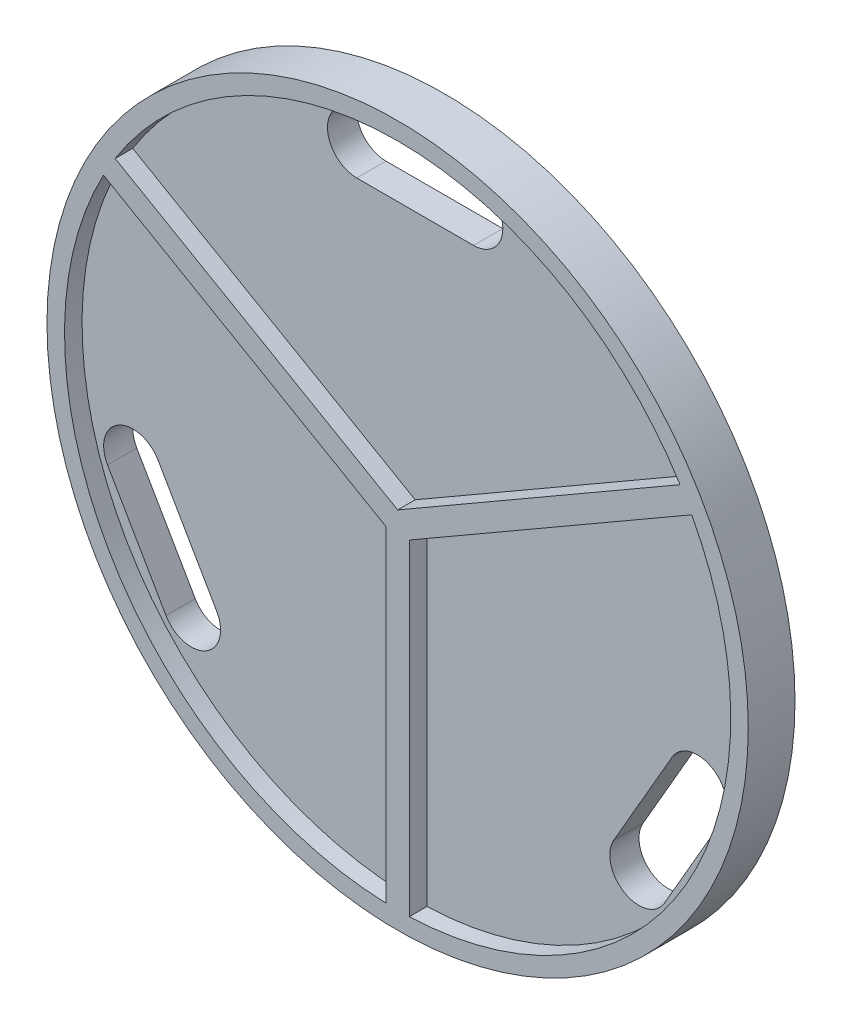
ISO-10303-21;
HEADER;
FILE_DESCRIPTION(('STEP AP214'),'2;1');
FILE_NAME('part.step','',(''),(''),'','','');
FILE_SCHEMA(('AUTOMOTIVE_DESIGN { 1 0 10303 214 1 1 1 1 }'));
ENDSEC;
DATA;
#1=APPLICATION_CONTEXT('core data for automotive mechanical design processes');
#2=APPLICATION_PROTOCOL_DEFINITION('international standard','automotive_design',2000,#1);
#3=PRODUCT_CONTEXT('',#1,'mechanical');
#4=PRODUCT('Part','Part','',(#3));
#5=PRODUCT_RELATED_PRODUCT_CATEGORY('part','',(#4));
#6=PRODUCT_DEFINITION_FORMATION('','',#4);
#7=PRODUCT_DEFINITION_CONTEXT('part definition',#1,'design');
#8=PRODUCT_DEFINITION('design','',#6,#7);
#9=PRODUCT_DEFINITION_SHAPE('','',#8);
#10=(LENGTH_UNIT() NAMED_UNIT(*) SI_UNIT(.MILLI.,.METRE.));
#11=(NAMED_UNIT(*) PLANE_ANGLE_UNIT() SI_UNIT($,.RADIAN.));
#12=(NAMED_UNIT(*) SI_UNIT($,.STERADIAN.) SOLID_ANGLE_UNIT());
#13=UNCERTAINTY_MEASURE_WITH_UNIT(LENGTH_MEASURE(1.E-05),#10,'distance_accuracy_value','');
#14=(GEOMETRIC_REPRESENTATION_CONTEXT(3) GLOBAL_UNCERTAINTY_ASSIGNED_CONTEXT((#13)) GLOBAL_UNIT_ASSIGNED_CONTEXT((#10,
#11,#12)) REPRESENTATION_CONTEXT('',''));
#15=CARTESIAN_POINT('',(0.,0.,0.));
#16=DIRECTION('',(0.,0.,1.));
#17=DIRECTION('',(1.,0.,0.));
#18=AXIS2_PLACEMENT_3D('',#15,#16,#17);
#19=CARTESIAN_POINT('',(0.,0.,5.));
#20=DIRECTION('',(0.,0.,1.));
#21=DIRECTION('',(1.,0.,0.));
#22=AXIS2_PLACEMENT_3D('',#19,#20,#21);
#23=PLANE('',#22);
#24=DIRECTION('',(-0.866025403784436,0.500000000000004,0.));
#25=VECTOR('',#24,1.);
#26=CARTESIAN_POINT('',(-1.00000000000001,-1.73205080756887,5.));
#27=LINE('',#26,#25);
#28=CARTESIAN_POINT('',(-1.99999999999999,-1.15470053837925,5.));
#29=VERTEX_POINT('',#28);
#30=CARTESIAN_POINT('',(-50.3330518009984,26.7503999296836,5.));
#31=VERTEX_POINT('',#30);
#32=EDGE_CURVE('E205',#29,#31,#27,.T.);
#33=ORIENTED_EDGE('',*,*,#32,.T.);
#34=CARTESIAN_POINT('',(0.,0.,5.));
#35=DIRECTION('',(0.,0.,1.));
#36=DIRECTION('',(1.,0.,0.));
#37=AXIS2_PLACEMENT_3D('',#34,#35,#36);
#38=CIRCLE('',#37,57.);
#39=CARTESIAN_POINT('',(-1.99999999999925,-56.9649014745045,5.));
#40=VERTEX_POINT('',#39);
#41=EDGE_CURVE('E252',#31,#40,#38,.T.);
#42=ORIENTED_EDGE('',*,*,#41,.T.);
#43=DIRECTION('',(0.,-1.,0.));
#44=VECTOR('',#43,1.);
#45=CARTESIAN_POINT('',(-2.,0.,5.));
#46=LINE('',#45,#44);
#47=EDGE_CURVE('E57',#29,#40,#46,.T.);
#48=ORIENTED_EDGE('',*,*,#47,.F.);
#49=EDGE_LOOP('',(#33,#42,#48));
#50=FACE_BOUND('',#49,.T.);
#51=DIRECTION('',(0.499999999999998,-0.86602540378444,0.));
#52=VECTOR('',#51,1.);
#53=CARTESIAN_POINT('',(-52.6313972081443,-18.8397459621553,5.));
#54=LINE('',#53,#52);
#55=CARTESIAN_POINT('',(-52.6313972081443,-18.8397459621553,5.));
#56=VERTEX_POINT('',#55);
#57=CARTESIAN_POINT('',(-42.6313972081441,-36.1602540378445,5.));
#58=VERTEX_POINT('',#57);
#59=EDGE_CURVE('E348',#56,#58,#54,.T.);
#60=ORIENTED_EDGE('',*,*,#59,.F.);
#61=CARTESIAN_POINT('',(-48.3012701892221,-16.3397459621553,5.));
#62=DIRECTION('',(0.,0.,1.));
#63=DIRECTION('',(1.,0.,0.));
#64=AXIS2_PLACEMENT_3D('',#61,#62,#63);
#65=CIRCLE('',#64,5.);
#66=CARTESIAN_POINT('',(-43.9711431702998,-13.8397459621554,5.));
#67=VERTEX_POINT('',#66);
#68=EDGE_CURVE('E345',#67,#56,#65,.T.);
#69=ORIENTED_EDGE('',*,*,#68,.F.);
#70=DIRECTION('',(-0.499999999999998,0.86602540378444,0.));
#71=VECTOR('',#70,1.);
#72=CARTESIAN_POINT('',(-43.9711431702998,-13.8397459621554,5.));
#73=LINE('',#72,#71);
#74=CARTESIAN_POINT('',(-33.9711431702997,-31.1602540378445,5.));
#75=VERTEX_POINT('',#74);
#76=EDGE_CURVE('E356',#75,#67,#73,.T.);
#77=ORIENTED_EDGE('',*,*,#76,.F.);
#78=CARTESIAN_POINT('',(-38.301270189222,-33.6602540378443,5.));
#79=DIRECTION('',(0.,0.,1.));
#80=DIRECTION('',(1.,0.,0.));
#81=AXIS2_PLACEMENT_3D('',#78,#79,#80);
#82=CIRCLE('',#81,5.);
#83=EDGE_CURVE('E352',#58,#75,#82,.T.);
#84=ORIENTED_EDGE('',*,*,#83,.F.);
#85=EDGE_LOOP('',(#60,#69,#77,#84));
#86=FACE_BOUND('',#85,.T.);
#87=ADVANCED_FACE('F41',(#50,#86),#23,.T.);
#88=DIRECTION('',(0.,-1.,0.));
#89=VECTOR('',#88,1.);
#90=CARTESIAN_POINT('',(2.,0.,5.));
#91=LINE('',#90,#89);
#92=CARTESIAN_POINT('',(2.00000000000002,-1.15470053837924,5.));
#93=VERTEX_POINT('',#92);
#94=CARTESIAN_POINT('',(2.00000000000074,-56.9649014745044,5.));
#95=VERTEX_POINT('',#94);
#96=EDGE_CURVE('E198',#93,#95,#91,.T.);
#97=ORIENTED_EDGE('',*,*,#96,.T.);
#98=CARTESIAN_POINT('',(50.3330518009984,26.7503999296836,5.));
#99=VERTEX_POINT('',#98);
#100=EDGE_CURVE('E249',#95,#99,#38,.T.);
#101=ORIENTED_EDGE('',*,*,#100,.T.);
#102=DIRECTION('',(0.866025403784436,0.500000000000004,0.));
#103=VECTOR('',#102,1.);
#104=CARTESIAN_POINT('',(1.00000000000001,-1.73205080756887,5.));
#105=LINE('',#104,#103);
#106=EDGE_CURVE('E65',#93,#99,#105,.T.);
#107=ORIENTED_EDGE('',*,*,#106,.F.);
#108=EDGE_LOOP('',(#97,#101,#107));
#109=FACE_BOUND('',#108,.T.);
#110=DIRECTION('',(-0.499999999999997,-0.86602540378444,0.));
#111=VECTOR('',#110,1.);
#112=CARTESIAN_POINT('',(43.9711431702998,-13.8397459621554,5.));
#113=LINE('',#112,#111);
#114=CARTESIAN_POINT('',(43.9711431702998,-13.8397459621554,5.));
#115=VERTEX_POINT('',#114);
#116=CARTESIAN_POINT('',(33.9711431702997,-31.1602540378445,5.));
#117=VERTEX_POINT('',#116);
#118=EDGE_CURVE('E305',#115,#117,#113,.T.);
#119=ORIENTED_EDGE('',*,*,#118,.F.);
#120=CARTESIAN_POINT('',(48.3012701892221,-16.3397459621553,5.));
#121=DIRECTION('',(0.,0.,1.));
#122=DIRECTION('',(-1.,0.,0.));
#123=AXIS2_PLACEMENT_3D('',#120,#121,#122);
#124=CIRCLE('',#123,5.00000000000002);
#125=CARTESIAN_POINT('',(52.6313972081443,-18.8397459621553,5.));
#126=VERTEX_POINT('',#125);
#127=EDGE_CURVE('E302',#126,#115,#124,.T.);
#128=ORIENTED_EDGE('',*,*,#127,.F.);
#129=DIRECTION('',(0.499999999999998,0.86602540378444,0.));
#130=VECTOR('',#129,1.);
#131=CARTESIAN_POINT('',(52.6313972081443,-18.8397459621553,5.));
#132=LINE('',#131,#130);
#133=CARTESIAN_POINT('',(42.6313972081441,-36.1602540378445,5.));
#134=VERTEX_POINT('',#133);
#135=EDGE_CURVE('E313',#134,#126,#132,.T.);
#136=ORIENTED_EDGE('',*,*,#135,.F.);
#137=CARTESIAN_POINT('',(38.301270189222,-33.6602540378443,5.));
#138=DIRECTION('',(0.,0.,1.));
#139=DIRECTION('',(-1.,0.,0.));
#140=AXIS2_PLACEMENT_3D('',#137,#138,#139);
#141=CIRCLE('',#140,5.);
#142=EDGE_CURVE('E309',#117,#134,#141,.T.);
#143=ORIENTED_EDGE('',*,*,#142,.F.);
#144=EDGE_LOOP('',(#119,#128,#136,#143));
#145=FACE_BOUND('',#144,.T.);
#146=ADVANCED_FACE('F415',(#109,#145),#23,.T.);
#147=CARTESIAN_POINT('',(0.,0.,8.));
#148=DIRECTION('',(0.,0.,-1.));
#149=DIRECTION('',(-1.,0.,0.));
#150=AXIS2_PLACEMENT_3D('',#147,#148,#149);
#151=CYLINDRICAL_SURFACE('',#150,57.);
#152=DIRECTION('',(0.,0.,-1.));
#153=VECTOR('',#152,1.);
#154=CARTESIAN_POINT('',(-50.3330518009984,26.7503999296836,141.191717813532));
#155=LINE('',#154,#153);
#156=CARTESIAN_POINT('',(-50.3330518009984,26.7503999296836,8.));
#157=VERTEX_POINT('',#156);
#158=EDGE_CURVE('E207',#157,#31,#155,.T.);
#159=ORIENTED_EDGE('',*,*,#158,.F.);
#160=CARTESIAN_POINT('',(0.,0.,8.));
#161=DIRECTION('',(0.,0.,1.));
#162=DIRECTION('',(1.,0.,0.));
#163=AXIS2_PLACEMENT_3D('',#160,#161,#162);
#164=CIRCLE('',#163,57.);
#165=CARTESIAN_POINT('',(-1.99999999999925,-56.9649014745045,8.));
#166=VERTEX_POINT('',#165);
#167=EDGE_CURVE('E211',#157,#166,#164,.T.);
#168=ORIENTED_EDGE('',*,*,#167,.T.);
#169=DIRECTION('',(0.,0.,-1.));
#170=VECTOR('',#169,1.);
#171=CARTESIAN_POINT('',(-1.99999999999925,-56.9649014745045,141.191717813532));
#172=LINE('',#171,#170);
#173=EDGE_CURVE('E192',#166,#40,#172,.T.);
#174=ORIENTED_EDGE('',*,*,#173,.T.);
#175=ORIENTED_EDGE('',*,*,#41,.F.);
#176=EDGE_LOOP('',(#159,#168,#174,#175));
#177=FACE_BOUND('',#176,.T.);
#178=ADVANCED_FACE('F421',(#177),#151,.F.);
#179=DIRECTION('',(0.,0.,-1.));
#180=VECTOR('',#179,1.);
#181=CARTESIAN_POINT('',(2.00000000000074,-56.9649014745044,141.191717813532));
#182=LINE('',#181,#180);
#183=CARTESIAN_POINT('',(2.00000000000074,-56.9649014745044,8.00000000000001));
#184=VERTEX_POINT('',#183);
#185=EDGE_CURVE('E221',#184,#95,#182,.T.);
#186=ORIENTED_EDGE('',*,*,#185,.F.);
#187=CARTESIAN_POINT('',(50.3330518009984,26.7503999296836,8.));
#188=VERTEX_POINT('',#187);
#189=EDGE_CURVE('E244',#184,#188,#164,.T.);
#190=ORIENTED_EDGE('',*,*,#189,.T.);
#191=DIRECTION('',(0.,0.,-1.));
#192=VECTOR('',#191,1.);
#193=CARTESIAN_POINT('',(50.3330518009984,26.7503999296836,141.191717813532));
#194=LINE('',#193,#192);
#195=EDGE_CURVE('E228',#188,#99,#194,.T.);
#196=ORIENTED_EDGE('',*,*,#195,.T.);
#197=ORIENTED_EDGE('',*,*,#100,.F.);
#198=EDGE_LOOP('',(#186,#190,#196,#197));
#199=FACE_BOUND('',#198,.T.);
#200=ADVANCED_FACE('F424',(#199),#151,.F.);
#201=DIRECTION('',(0.866025403784436,0.500000000000004,0.));
#202=VECTOR('',#201,1.);
#203=CARTESIAN_POINT('',(-1.00000000000001,1.73205080756887,5.));
#204=LINE('',#203,#202);
#205=CARTESIAN_POINT('',(0.,2.30940107675851,5.));
#206=VERTEX_POINT('',#205);
#207=CARTESIAN_POINT('',(48.3330518009984,30.2145015448213,5.));
#208=VERTEX_POINT('',#207);
#209=EDGE_CURVE('E437',#206,#208,#204,.T.);
#210=ORIENTED_EDGE('',*,*,#209,.T.);
#211=CARTESIAN_POINT('',(-48.3330518009983,30.2145015448213,5.));
#212=VERTEX_POINT('',#211);
#213=EDGE_CURVE('E247',#208,#212,#38,.T.);
#214=ORIENTED_EDGE('',*,*,#213,.T.);
#215=DIRECTION('',(-0.866025403784436,0.500000000000004,0.));
#216=VECTOR('',#215,1.);
#217=CARTESIAN_POINT('',(1.00000000000001,1.73205080756887,5.));
#218=LINE('',#217,#216);
#219=EDGE_CURVE('E240',#206,#212,#218,.T.);
#220=ORIENTED_EDGE('',*,*,#219,.F.);
#221=EDGE_LOOP('',(#210,#214,#220));
#222=FACE_BOUND('',#221,.T.);
#223=DIRECTION('',(-1.,0.,0.));
#224=VECTOR('',#223,1.);
#225=CARTESIAN_POINT('',(10.0000000000006,55.,5.));
#226=LINE('',#225,#224);
#227=CARTESIAN_POINT('',(10.0000000000006,55.,5.));
#228=VERTEX_POINT('',#227);
#229=CARTESIAN_POINT('',(-9.99999999999983,55.0000000000001,5.));
#230=VERTEX_POINT('',#229);
#231=EDGE_CURVE('E262',#228,#230,#226,.T.);
#232=ORIENTED_EDGE('',*,*,#231,.F.);
#233=CARTESIAN_POINT('',(10.0000000000005,50.,5.));
#234=DIRECTION('',(0.,0.,1.));
#235=DIRECTION('',(1.,0.,0.));
#236=AXIS2_PLACEMENT_3D('',#233,#234,#235);
#237=CIRCLE('',#236,5.00000000000001);
#238=CARTESIAN_POINT('',(10.0000000000004,44.9999999999999,5.));
#239=VERTEX_POINT('',#238);
#240=EDGE_CURVE('E259',#239,#228,#237,.T.);
#241=ORIENTED_EDGE('',*,*,#240,.F.);
#242=DIRECTION('',(1.,0.,0.));
#243=VECTOR('',#242,1.);
#244=CARTESIAN_POINT('',(10.0000000000004,44.9999999999999,5.));
#245=LINE('',#244,#243);
#246=CARTESIAN_POINT('',(-9.99999999999993,45.0000000000001,5.));
#247=VERTEX_POINT('',#246);
#248=EDGE_CURVE('E270',#247,#239,#245,.T.);
#249=ORIENTED_EDGE('',*,*,#248,.F.);
#250=CARTESIAN_POINT('',(-9.99999999999969,50.0000000000001,5.));
#251=DIRECTION('',(0.,0.,1.));
#252=DIRECTION('',(1.,0.,0.));
#253=AXIS2_PLACEMENT_3D('',#250,#251,#252);
#254=CIRCLE('',#253,5.00000000000002);
#255=EDGE_CURVE('E266',#230,#247,#254,.T.);
#256=ORIENTED_EDGE('',*,*,#255,.F.);
#257=EDGE_LOOP('',(#232,#241,#249,#256));
#258=FACE_BOUND('',#257,.T.);
#259=ADVANCED_FACE('F417',(#222,#258),#23,.T.);
#260=CARTESIAN_POINT('',(0.,0.,0.));
#261=DIRECTION('',(0.,0.,1.));
#262=DIRECTION('',(1.,0.,0.));
#263=AXIS2_PLACEMENT_3D('',#260,#261,#262);
#264=PLANE('',#263);
#265=CARTESIAN_POINT('',(48.3012701892221,-16.3397459621553,0.));
#266=DIRECTION('',(0.,0.,1.));
#267=DIRECTION('',(-1.,0.,0.));
#268=AXIS2_PLACEMENT_3D('',#265,#266,#267);
#269=CIRCLE('',#268,5.00000000000002);
#270=CARTESIAN_POINT('',(52.6313972081443,-18.8397459621553,0.));
#271=VERTEX_POINT('',#270);
#272=CARTESIAN_POINT('',(43.9711431702998,-13.8397459621554,0.));
#273=VERTEX_POINT('',#272);
#274=EDGE_CURVE('E301',#271,#273,#269,.T.);
#275=ORIENTED_EDGE('',*,*,#274,.T.);
#276=DIRECTION('',(-0.499999999999997,-0.86602540378444,0.));
#277=VECTOR('',#276,1.);
#278=CARTESIAN_POINT('',(43.9711431702998,-13.8397459621554,0.));
#279=LINE('',#278,#277);
#280=CARTESIAN_POINT('',(33.9711431702997,-31.1602540378445,0.));
#281=VERTEX_POINT('',#280);
#282=EDGE_CURVE('E320',#273,#281,#279,.T.);
#283=ORIENTED_EDGE('',*,*,#282,.T.);
#284=CARTESIAN_POINT('',(38.301270189222,-33.6602540378443,0.));
#285=DIRECTION('',(0.,0.,1.));
#286=DIRECTION('',(-1.,0.,0.));
#287=AXIS2_PLACEMENT_3D('',#284,#285,#286);
#288=CIRCLE('',#287,5.);
#289=CARTESIAN_POINT('',(42.6313972081441,-36.1602540378445,0.));
#290=VERTEX_POINT('',#289);
#291=EDGE_CURVE('E324',#281,#290,#288,.T.);
#292=ORIENTED_EDGE('',*,*,#291,.T.);
#293=DIRECTION('',(0.499999999999998,0.86602540378444,0.));
#294=VECTOR('',#293,1.);
#295=CARTESIAN_POINT('',(52.6313972081443,-18.8397459621553,0.));
#296=LINE('',#295,#294);
#297=EDGE_CURVE('E306',#290,#271,#296,.T.);
#298=ORIENTED_EDGE('',*,*,#297,.T.);
#299=EDGE_LOOP('',(#275,#283,#292,#298));
#300=FACE_BOUND('',#299,.T.);
#301=CARTESIAN_POINT('',(0.,0.,0.));
#302=DIRECTION('',(0.,0.,1.));
#303=DIRECTION('',(1.,0.,0.));
#304=AXIS2_PLACEMENT_3D('',#301,#302,#303);
#305=CIRCLE('',#304,60.);
#306=CARTESIAN_POINT('',(60.,0.,0.));
#307=VERTEX_POINT('',#306);
#308=EDGE_CURVE('E11',#307,#307,#305,.T.);
#309=ORIENTED_EDGE('',*,*,#308,.F.);
#310=EDGE_LOOP('',(#309));
#311=FACE_BOUND('',#310,.T.);
#312=CARTESIAN_POINT('',(-48.3012701892221,-16.3397459621553,0.));
#313=DIRECTION('',(0.,0.,1.));
#314=DIRECTION('',(1.,0.,0.));
#315=AXIS2_PLACEMENT_3D('',#312,#313,#314);
#316=CIRCLE('',#315,5.);
#317=CARTESIAN_POINT('',(-43.9711431702998,-13.8397459621554,0.));
#318=VERTEX_POINT('',#317);
#319=CARTESIAN_POINT('',(-52.6313972081443,-18.8397459621553,0.));
#320=VERTEX_POINT('',#319);
#321=EDGE_CURVE('E344',#318,#320,#316,.T.);
#322=ORIENTED_EDGE('',*,*,#321,.T.);
#323=DIRECTION('',(0.499999999999998,-0.86602540378444,0.));
#324=VECTOR('',#323,1.);
#325=CARTESIAN_POINT('',(-52.6313972081443,-18.8397459621553,0.));
#326=LINE('',#325,#324);
#327=CARTESIAN_POINT('',(-42.6313972081441,-36.1602540378445,0.));
#328=VERTEX_POINT('',#327);
#329=EDGE_CURVE('E363',#320,#328,#326,.T.);
#330=ORIENTED_EDGE('',*,*,#329,.T.);
#331=CARTESIAN_POINT('',(-38.301270189222,-33.6602540378443,0.));
#332=DIRECTION('',(0.,0.,1.));
#333=DIRECTION('',(1.,0.,0.));
#334=AXIS2_PLACEMENT_3D('',#331,#332,#333);
#335=CIRCLE('',#334,5.);
#336=CARTESIAN_POINT('',(-33.9711431702997,-31.1602540378445,0.));
#337=VERTEX_POINT('',#336);
#338=EDGE_CURVE('E367',#328,#337,#335,.T.);
#339=ORIENTED_EDGE('',*,*,#338,.T.);
#340=DIRECTION('',(-0.499999999999998,0.86602540378444,0.));
#341=VECTOR('',#340,1.);
#342=CARTESIAN_POINT('',(-43.9711431702998,-13.8397459621554,0.));
#343=LINE('',#342,#341);
#344=EDGE_CURVE('E349',#337,#318,#343,.T.);
#345=ORIENTED_EDGE('',*,*,#344,.T.);
#346=EDGE_LOOP('',(#322,#330,#339,#345));
#347=FACE_BOUND('',#346,.T.);
#348=CARTESIAN_POINT('',(10.0000000000005,50.,0.));
#349=DIRECTION('',(0.,0.,1.));
#350=DIRECTION('',(1.,0.,0.));
#351=AXIS2_PLACEMENT_3D('',#348,#349,#350);
#352=CIRCLE('',#351,5.00000000000001);
#353=CARTESIAN_POINT('',(10.0000000000004,44.9999999999999,0.));
#354=VERTEX_POINT('',#353);
#355=CARTESIAN_POINT('',(10.0000000000006,55.,0.));
#356=VERTEX_POINT('',#355);
#357=EDGE_CURVE('E258',#354,#356,#352,.T.);
#358=ORIENTED_EDGE('',*,*,#357,.T.);
#359=DIRECTION('',(-1.,0.,0.));
#360=VECTOR('',#359,1.);
#361=CARTESIAN_POINT('',(10.0000000000006,55.,0.));
#362=LINE('',#361,#360);
#363=CARTESIAN_POINT('',(-9.99999999999983,55.0000000000001,0.));
#364=VERTEX_POINT('',#363);
#365=EDGE_CURVE('E277',#356,#364,#362,.T.);
#366=ORIENTED_EDGE('',*,*,#365,.T.);
#367=CARTESIAN_POINT('',(-9.99999999999969,50.0000000000001,0.));
#368=DIRECTION('',(0.,0.,1.));
#369=DIRECTION('',(1.,0.,0.));
#370=AXIS2_PLACEMENT_3D('',#367,#368,#369);
#371=CIRCLE('',#370,5.00000000000002);
#372=CARTESIAN_POINT('',(-9.99999999999993,45.0000000000001,0.));
#373=VERTEX_POINT('',#372);
#374=EDGE_CURVE('E281',#364,#373,#371,.T.);
#375=ORIENTED_EDGE('',*,*,#374,.T.);
#376=DIRECTION('',(1.,0.,0.));
#377=VECTOR('',#376,1.);
#378=CARTESIAN_POINT('',(10.0000000000004,44.9999999999999,0.));
#379=LINE('',#378,#377);
#380=EDGE_CURVE('E263',#373,#354,#379,.T.);
#381=ORIENTED_EDGE('',*,*,#380,.T.);
#382=EDGE_LOOP('',(#358,#366,#375,#381));
#383=FACE_BOUND('',#382,.T.);
#384=ADVANCED_FACE('F392',(#300,#311,#347,#383),#264,.F.);
#385=CARTESIAN_POINT('',(0.,0.,5.));
#386=DIRECTION('',(0.,0.,-1.));
#387=DIRECTION('',(-1.,0.,0.));
#388=AXIS2_PLACEMENT_3D('',#385,#386,#387);
#389=CYLINDRICAL_SURFACE('',#388,60.);
#390=ORIENTED_EDGE('',*,*,#308,.T.);
#391=EDGE_LOOP('',(#390));
#392=FACE_BOUND('',#391,.T.);
#393=CARTESIAN_POINT('',(0.,0.,8.));
#394=DIRECTION('',(0.,0.,1.));
#395=DIRECTION('',(1.,0.,0.));
#396=AXIS2_PLACEMENT_3D('',#393,#394,#395);
#397=CIRCLE('',#396,60.);
#398=CARTESIAN_POINT('',(60.,0.,8.));
#399=VERTEX_POINT('',#398);
#400=EDGE_CURVE('E254',#399,#399,#397,.T.);
#401=ORIENTED_EDGE('',*,*,#400,.F.);
#402=EDGE_LOOP('',(#401));
#403=FACE_BOUND('',#402,.T.);
#404=ADVANCED_FACE('F43',(#392,#403),#389,.T.);
#405=CARTESIAN_POINT('',(-48.3012701892221,-16.3397459621553,5.));
#406=DIRECTION('',(0.,0.,-1.));
#407=DIRECTION('',(-1.,0.,0.));
#408=AXIS2_PLACEMENT_3D('',#405,#406,#407);
#409=CYLINDRICAL_SURFACE('',#408,5.);
#410=ORIENTED_EDGE('',*,*,#321,.F.);
#411=DIRECTION('',(0.,0.,-1.));
#412=VECTOR('',#411,1.);
#413=CARTESIAN_POINT('',(-43.9711431702998,-13.8397459621554,5.));
#414=LINE('',#413,#412);
#415=EDGE_CURVE('E359',#67,#318,#414,.T.);
#416=ORIENTED_EDGE('',*,*,#415,.F.);
#417=ORIENTED_EDGE('',*,*,#68,.T.);
#418=DIRECTION('',(0.,0.,-1.));
#419=VECTOR('',#418,1.);
#420=CARTESIAN_POINT('',(-52.6313972081443,-18.8397459621553,5.));
#421=LINE('',#420,#419);
#422=EDGE_CURVE('E50',#56,#320,#421,.T.);
#423=ORIENTED_EDGE('',*,*,#422,.T.);
#424=EDGE_LOOP('',(#410,#416,#417,#423));
#425=FACE_BOUND('',#424,.T.);
#426=ADVANCED_FACE('F386',(#425),#409,.F.);
#427=CARTESIAN_POINT('',(-52.6313972081443,-18.8397459621553,5.));
#428=DIRECTION('',(0.86602540378444,0.499999999999998,0.));
#429=DIRECTION('',(-0.499999999999998,0.86602540378444,0.));
#430=AXIS2_PLACEMENT_3D('',#427,#428,#429);
#431=PLANE('',#430);
#432=ORIENTED_EDGE('',*,*,#329,.F.);
#433=ORIENTED_EDGE('',*,*,#422,.F.);
#434=ORIENTED_EDGE('',*,*,#59,.T.);
#435=DIRECTION('',(0.,0.,-1.));
#436=VECTOR('',#435,1.);
#437=CARTESIAN_POINT('',(-42.6313972081441,-36.1602540378445,5.));
#438=LINE('',#437,#436);
#439=EDGE_CURVE('E380',#58,#328,#438,.T.);
#440=ORIENTED_EDGE('',*,*,#439,.T.);
#441=EDGE_LOOP('',(#432,#433,#434,#440));
#442=FACE_BOUND('',#441,.T.);
#443=ADVANCED_FACE('F402',(#442),#431,.T.);
#444=CARTESIAN_POINT('',(-38.301270189222,-33.6602540378443,5.));
#445=DIRECTION('',(0.,0.,-1.));
#446=DIRECTION('',(-1.,0.,0.));
#447=AXIS2_PLACEMENT_3D('',#444,#445,#446);
#448=CYLINDRICAL_SURFACE('',#447,5.);
#449=ORIENTED_EDGE('',*,*,#338,.F.);
#450=ORIENTED_EDGE('',*,*,#439,.F.);
#451=ORIENTED_EDGE('',*,*,#83,.T.);
#452=DIRECTION('',(0.,0.,-1.));
#453=VECTOR('',#452,1.);
#454=CARTESIAN_POINT('',(-33.9711431702997,-31.1602540378445,5.));
#455=LINE('',#454,#453);
#456=EDGE_CURVE('E377',#75,#337,#455,.T.);
#457=ORIENTED_EDGE('',*,*,#456,.T.);
#458=EDGE_LOOP('',(#449,#450,#451,#457));
#459=FACE_BOUND('',#458,.T.);
#460=ADVANCED_FACE('F404',(#459),#448,.F.);
#461=CARTESIAN_POINT('',(-43.9711431702998,-13.8397459621554,5.));
#462=DIRECTION('',(-0.86602540378444,-0.499999999999998,0.));
#463=DIRECTION('',(0.499999999999998,-0.86602540378444,0.));
#464=AXIS2_PLACEMENT_3D('',#461,#462,#463);
#465=PLANE('',#464);
#466=ORIENTED_EDGE('',*,*,#344,.F.);
#467=ORIENTED_EDGE('',*,*,#456,.F.);
#468=ORIENTED_EDGE('',*,*,#76,.T.);
#469=ORIENTED_EDGE('',*,*,#415,.T.);
#470=EDGE_LOOP('',(#466,#467,#468,#469));
#471=FACE_BOUND('',#470,.T.);
#472=ADVANCED_FACE('F397',(#471),#465,.T.);
#473=CARTESIAN_POINT('',(48.3012701892221,-16.3397459621553,5.));
#474=DIRECTION('',(0.,0.,-1.));
#475=DIRECTION('',(-1.,0.,0.));
#476=AXIS2_PLACEMENT_3D('',#473,#474,#475);
#477=CYLINDRICAL_SURFACE('',#476,5.00000000000002);
#478=ORIENTED_EDGE('',*,*,#274,.F.);
#479=DIRECTION('',(0.,0.,-1.));
#480=VECTOR('',#479,1.);
#481=CARTESIAN_POINT('',(52.6313972081443,-18.8397459621553,5.));
#482=LINE('',#481,#480);
#483=EDGE_CURVE('E316',#126,#271,#482,.T.);
#484=ORIENTED_EDGE('',*,*,#483,.F.);
#485=ORIENTED_EDGE('',*,*,#127,.T.);
#486=DIRECTION('',(0.,0.,-1.));
#487=VECTOR('',#486,1.);
#488=CARTESIAN_POINT('',(43.9711431702998,-13.8397459621554,5.));
#489=LINE('',#488,#487);
#490=EDGE_CURVE('E340',#115,#273,#489,.T.);
#491=ORIENTED_EDGE('',*,*,#490,.T.);
#492=EDGE_LOOP('',(#478,#484,#485,#491));
#493=FACE_BOUND('',#492,.T.);
#494=ADVANCED_FACE('F411',(#493),#477,.F.);
#495=CARTESIAN_POINT('',(43.9711431702998,-13.8397459621554,5.));
#496=DIRECTION('',(0.86602540378444,-0.499999999999997,0.));
#497=DIRECTION('',(0.499999999999997,0.86602540378444,0.));
#498=AXIS2_PLACEMENT_3D('',#495,#496,#497);
#499=PLANE('',#498);
#500=ORIENTED_EDGE('',*,*,#282,.F.);
#501=ORIENTED_EDGE('',*,*,#490,.F.);
#502=ORIENTED_EDGE('',*,*,#118,.T.);
#503=DIRECTION('',(0.,0.,-1.));
#504=VECTOR('',#503,1.);
#505=CARTESIAN_POINT('',(33.9711431702997,-31.1602540378445,5.));
#506=LINE('',#505,#504);
#507=EDGE_CURVE('E337',#117,#281,#506,.T.);
#508=ORIENTED_EDGE('',*,*,#507,.T.);
#509=EDGE_LOOP('',(#500,#501,#502,#508));
#510=FACE_BOUND('',#509,.T.);
#511=ADVANCED_FACE('F477',(#510),#499,.T.);
#512=CARTESIAN_POINT('',(38.301270189222,-33.6602540378443,5.));
#513=DIRECTION('',(0.,0.,-1.));
#514=DIRECTION('',(-1.,0.,0.));
#515=AXIS2_PLACEMENT_3D('',#512,#513,#514);
#516=CYLINDRICAL_SURFACE('',#515,5.);
#517=ORIENTED_EDGE('',*,*,#291,.F.);
#518=ORIENTED_EDGE('',*,*,#507,.F.);
#519=ORIENTED_EDGE('',*,*,#142,.T.);
#520=DIRECTION('',(0.,0.,-1.));
#521=VECTOR('',#520,1.);
#522=CARTESIAN_POINT('',(42.6313972081441,-36.1602540378445,5.));
#523=LINE('',#522,#521);
#524=EDGE_CURVE('E334',#134,#290,#523,.T.);
#525=ORIENTED_EDGE('',*,*,#524,.T.);
#526=EDGE_LOOP('',(#517,#518,#519,#525));
#527=FACE_BOUND('',#526,.T.);
#528=ADVANCED_FACE('F473',(#527),#516,.F.);
#529=CARTESIAN_POINT('',(52.6313972081443,-18.8397459621553,5.));
#530=DIRECTION('',(-0.86602540378444,0.499999999999998,0.));
#531=DIRECTION('',(-0.499999999999998,-0.86602540378444,0.));
#532=AXIS2_PLACEMENT_3D('',#529,#530,#531);
#533=PLANE('',#532);
#534=ORIENTED_EDGE('',*,*,#297,.F.);
#535=ORIENTED_EDGE('',*,*,#524,.F.);
#536=ORIENTED_EDGE('',*,*,#135,.T.);
#537=ORIENTED_EDGE('',*,*,#483,.T.);
#538=EDGE_LOOP('',(#534,#535,#536,#537));
#539=FACE_BOUND('',#538,.T.);
#540=ADVANCED_FACE('F470',(#539),#533,.T.);
#541=CARTESIAN_POINT('',(10.0000000000005,50.,5.));
#542=DIRECTION('',(0.,0.,-1.));
#543=DIRECTION('',(-1.,0.,0.));
#544=AXIS2_PLACEMENT_3D('',#541,#542,#543);
#545=CYLINDRICAL_SURFACE('',#544,5.00000000000001);
#546=ORIENTED_EDGE('',*,*,#357,.F.);
#547=DIRECTION('',(0.,0.,-1.));
#548=VECTOR('',#547,1.);
#549=CARTESIAN_POINT('',(10.0000000000004,44.9999999999999,5.));
#550=LINE('',#549,#548);
#551=EDGE_CURVE('E273',#239,#354,#550,.T.);
#552=ORIENTED_EDGE('',*,*,#551,.F.);
#553=ORIENTED_EDGE('',*,*,#240,.T.);
#554=DIRECTION('',(0.,0.,-1.));
#555=VECTOR('',#554,1.);
#556=CARTESIAN_POINT('',(10.0000000000006,55.,5.));
#557=LINE('',#556,#555);
#558=EDGE_CURVE('E297',#228,#356,#557,.T.);
#559=ORIENTED_EDGE('',*,*,#558,.T.);
#560=EDGE_LOOP('',(#546,#552,#553,#559));
#561=FACE_BOUND('',#560,.T.);
#562=ADVANCED_FACE('F452',(#561),#545,.F.);
#563=CARTESIAN_POINT('',(10.0000000000006,55.,5.));
#564=DIRECTION('',(0.,-1.,0.));
#565=DIRECTION('',(1.,0.,0.));
#566=AXIS2_PLACEMENT_3D('',#563,#564,#565);
#567=PLANE('',#566);
#568=ORIENTED_EDGE('',*,*,#365,.F.);
#569=ORIENTED_EDGE('',*,*,#558,.F.);
#570=ORIENTED_EDGE('',*,*,#231,.T.);
#571=DIRECTION('',(0.,0.,-1.));
#572=VECTOR('',#571,1.);
#573=CARTESIAN_POINT('',(-9.99999999999983,55.0000000000001,5.));
#574=LINE('',#573,#572);
#575=EDGE_CURVE('E294',#230,#364,#574,.T.);
#576=ORIENTED_EDGE('',*,*,#575,.T.);
#577=EDGE_LOOP('',(#568,#569,#570,#576));
#578=FACE_BOUND('',#577,.T.);
#579=ADVANCED_FACE('F446',(#578),#567,.T.);
#580=CARTESIAN_POINT('',(-9.99999999999969,50.0000000000001,5.));
#581=DIRECTION('',(0.,0.,-1.));
#582=DIRECTION('',(-1.,0.,0.));
#583=AXIS2_PLACEMENT_3D('',#580,#581,#582);
#584=CYLINDRICAL_SURFACE('',#583,5.00000000000002);
#585=ORIENTED_EDGE('',*,*,#374,.F.);
#586=ORIENTED_EDGE('',*,*,#575,.F.);
#587=ORIENTED_EDGE('',*,*,#255,.T.);
#588=DIRECTION('',(0.,0.,-1.));
#589=VECTOR('',#588,1.);
#590=CARTESIAN_POINT('',(-9.99999999999993,45.0000000000001,5.));
#591=LINE('',#590,#589);
#592=EDGE_CURVE('E291',#247,#373,#591,.T.);
#593=ORIENTED_EDGE('',*,*,#592,.T.);
#594=EDGE_LOOP('',(#585,#586,#587,#593));
#595=FACE_BOUND('',#594,.T.);
#596=ADVANCED_FACE('F449',(#595),#584,.F.);
#597=CARTESIAN_POINT('',(10.0000000000004,44.9999999999999,5.));
#598=DIRECTION('',(0.,1.,0.));
#599=DIRECTION('',(-1.,0.,0.));
#600=AXIS2_PLACEMENT_3D('',#597,#598,#599);
#601=PLANE('',#600);
#602=ORIENTED_EDGE('',*,*,#380,.F.);
#603=ORIENTED_EDGE('',*,*,#592,.F.);
#604=ORIENTED_EDGE('',*,*,#248,.T.);
#605=ORIENTED_EDGE('',*,*,#551,.T.);
#606=EDGE_LOOP('',(#602,#603,#604,#605));
#607=FACE_BOUND('',#606,.T.);
#608=ADVANCED_FACE('F455',(#607),#601,.T.);
#609=CARTESIAN_POINT('',(0.,0.,8.));
#610=DIRECTION('',(0.,0.,1.));
#611=DIRECTION('',(1.,0.,0.));
#612=AXIS2_PLACEMENT_3D('',#609,#610,#611);
#613=PLANE('',#612);
#614=CARTESIAN_POINT('',(48.3330518009984,30.2145015448213,8.));
#615=VERTEX_POINT('',#614);
#616=CARTESIAN_POINT('',(-48.3330518009983,30.2145015448213,8.));
#617=VERTEX_POINT('',#616);
#618=EDGE_CURVE('E248',#615,#617,#164,.T.);
#619=ORIENTED_EDGE('',*,*,#618,.F.);
#620=DIRECTION('',(0.866025403784436,0.500000000000004,0.));
#621=VECTOR('',#620,1.);
#622=CARTESIAN_POINT('',(-1.00000000000001,1.73205080756887,8.00000000000001));
#623=LINE('',#622,#621);
#624=CARTESIAN_POINT('',(0.,2.30940107675851,8.00000000000001));
#625=VERTEX_POINT('',#624);
#626=EDGE_CURVE('E231',#625,#615,#623,.T.);
#627=ORIENTED_EDGE('',*,*,#626,.F.);
#628=DIRECTION('',(-0.866025403784436,0.500000000000004,0.));
#629=VECTOR('',#628,1.);
#630=CARTESIAN_POINT('',(1.00000000000001,1.73205080756887,8.00000000000001));
#631=LINE('',#630,#629);
#632=EDGE_CURVE('E253',#625,#617,#631,.T.);
#633=ORIENTED_EDGE('',*,*,#632,.T.);
#634=EDGE_LOOP('',(#619,#627,#633));
#635=FACE_BOUND('',#634,.T.);
#636=ORIENTED_EDGE('',*,*,#167,.F.);
#637=DIRECTION('',(-0.866025403784436,0.500000000000004,0.));
#638=VECTOR('',#637,1.);
#639=CARTESIAN_POINT('',(-1.00000000000001,-1.73205080756887,8.00000000000001));
#640=LINE('',#639,#638);
#641=CARTESIAN_POINT('',(-1.99999999999999,-1.15470053837925,8.00000000000001));
#642=VERTEX_POINT('',#641);
#643=EDGE_CURVE('E204',#642,#157,#640,.T.);
#644=ORIENTED_EDGE('',*,*,#643,.F.);
#645=DIRECTION('',(0.,-1.,0.));
#646=VECTOR('',#645,1.);
#647=CARTESIAN_POINT('',(-2.,0.,8.00000000000001));
#648=LINE('',#647,#646);
#649=EDGE_CURVE('E187',#642,#166,#648,.T.);
#650=ORIENTED_EDGE('',*,*,#649,.T.);
#651=EDGE_LOOP('',(#636,#644,#650));
#652=FACE_BOUND('',#651,.T.);
#653=ORIENTED_EDGE('',*,*,#400,.T.);
#654=EDGE_LOOP('',(#653));
#655=FACE_BOUND('',#654,.T.);
#656=DIRECTION('',(0.866025403784436,0.500000000000004,0.));
#657=VECTOR('',#656,1.);
#658=CARTESIAN_POINT('',(1.00000000000001,-1.73205080756887,8.00000000000001));
#659=LINE('',#658,#657);
#660=CARTESIAN_POINT('',(2.00000000000002,-1.15470053837924,8.00000000000001));
#661=VERTEX_POINT('',#660);
#662=EDGE_CURVE('E197',#661,#188,#659,.T.);
#663=ORIENTED_EDGE('',*,*,#662,.T.);
#664=ORIENTED_EDGE('',*,*,#189,.F.);
#665=DIRECTION('',(0.,-1.,0.));
#666=VECTOR('',#665,1.);
#667=CARTESIAN_POINT('',(2.,0.,8.00000000000001));
#668=LINE('',#667,#666);
#669=EDGE_CURVE('E220',#661,#184,#668,.T.);
#670=ORIENTED_EDGE('',*,*,#669,.F.);
#671=EDGE_LOOP('',(#663,#664,#670));
#672=FACE_BOUND('',#671,.T.);
#673=ADVANCED_FACE('F209',(#635,#652,#655,#672),#613,.T.);
#674=DIRECTION('',(0.,0.,-1.));
#675=VECTOR('',#674,1.);
#676=CARTESIAN_POINT('',(48.3330518009984,30.2145015448213,141.191717813532));
#677=LINE('',#676,#675);
#678=EDGE_CURVE('E232',#615,#208,#677,.T.);
#679=ORIENTED_EDGE('',*,*,#678,.F.);
#680=ORIENTED_EDGE('',*,*,#618,.T.);
#681=DIRECTION('',(0.,0.,-1.));
#682=VECTOR('',#681,1.);
#683=CARTESIAN_POINT('',(-48.3330518009983,30.2145015448213,141.191717813532));
#684=LINE('',#683,#682);
#685=EDGE_CURVE('E241',#617,#212,#684,.T.);
#686=ORIENTED_EDGE('',*,*,#685,.T.);
#687=ORIENTED_EDGE('',*,*,#213,.F.);
#688=EDGE_LOOP('',(#679,#680,#686,#687));
#689=FACE_BOUND('',#688,.T.);
#690=ADVANCED_FACE('F433',(#689),#151,.F.);
#691=CARTESIAN_POINT('',(-1.00000000000001,-1.73205080756887,141.191717813532));
#692=DIRECTION('',(-0.500000000000004,-0.866025403784436,0.));
#693=DIRECTION('',(0.866025403784436,-0.500000000000004,0.));
#694=AXIS2_PLACEMENT_3D('',#691,#692,#693);
#695=PLANE('',#694);
#696=DIRECTION('',(0.,0.,-1.));
#697=VECTOR('',#696,1.);
#698=CARTESIAN_POINT('',(-1.99999999999999,-1.15470053837925,141.191717813532));
#699=LINE('',#698,#697);
#700=EDGE_CURVE('E190',#642,#29,#699,.T.);
#701=ORIENTED_EDGE('',*,*,#700,.F.);
#702=ORIENTED_EDGE('',*,*,#643,.T.);
#703=ORIENTED_EDGE('',*,*,#158,.T.);
#704=ORIENTED_EDGE('',*,*,#32,.F.);
#705=EDGE_LOOP('',(#701,#702,#703,#704));
#706=FACE_BOUND('',#705,.T.);
#707=ADVANCED_FACE('F202',(#706),#695,.T.);
#708=CARTESIAN_POINT('',(-2.,0.,141.191717813532));
#709=DIRECTION('',(1.,0.,0.));
#710=DIRECTION('',(0.,1.,0.));
#711=AXIS2_PLACEMENT_3D('',#708,#709,#710);
#712=PLANE('',#711);
#713=ORIENTED_EDGE('',*,*,#649,.F.);
#714=ORIENTED_EDGE('',*,*,#700,.T.);
#715=ORIENTED_EDGE('',*,*,#47,.T.);
#716=ORIENTED_EDGE('',*,*,#173,.F.);
#717=EDGE_LOOP('',(#713,#714,#715,#716));
#718=FACE_BOUND('',#717,.T.);
#719=ADVANCED_FACE('F189',(#718),#712,.F.);
#720=CARTESIAN_POINT('',(2.,0.,141.191717813532));
#721=DIRECTION('',(1.,0.,0.));
#722=DIRECTION('',(0.,1.,0.));
#723=AXIS2_PLACEMENT_3D('',#720,#721,#722);
#724=PLANE('',#723);
#725=DIRECTION('',(0.,0.,-1.));
#726=VECTOR('',#725,1.);
#727=CARTESIAN_POINT('',(2.00000000000002,-1.15470053837924,141.191717813532));
#728=LINE('',#727,#726);
#729=EDGE_CURVE('E225',#661,#93,#728,.T.);
#730=ORIENTED_EDGE('',*,*,#729,.F.);
#731=ORIENTED_EDGE('',*,*,#669,.T.);
#732=ORIENTED_EDGE('',*,*,#185,.T.);
#733=ORIENTED_EDGE('',*,*,#96,.F.);
#734=EDGE_LOOP('',(#730,#731,#732,#733));
#735=FACE_BOUND('',#734,.T.);
#736=ADVANCED_FACE('F518',(#735),#724,.T.);
#737=CARTESIAN_POINT('',(1.00000000000001,-1.73205080756887,141.191717813532));
#738=DIRECTION('',(-0.500000000000004,0.866025403784436,0.));
#739=DIRECTION('',(-0.866025403784436,-0.500000000000004,0.));
#740=AXIS2_PLACEMENT_3D('',#737,#738,#739);
#741=PLANE('',#740);
#742=ORIENTED_EDGE('',*,*,#662,.F.);
#743=ORIENTED_EDGE('',*,*,#729,.T.);
#744=ORIENTED_EDGE('',*,*,#106,.T.);
#745=ORIENTED_EDGE('',*,*,#195,.F.);
#746=EDGE_LOOP('',(#742,#743,#744,#745));
#747=FACE_BOUND('',#746,.T.);
#748=ADVANCED_FACE('F520',(#747),#741,.F.);
#749=CARTESIAN_POINT('',(-1.00000000000001,1.73205080756887,141.191717813532));
#750=DIRECTION('',(-0.500000000000004,0.866025403784436,0.));
#751=DIRECTION('',(-0.866025403784436,-0.500000000000004,0.));
#752=AXIS2_PLACEMENT_3D('',#749,#750,#751);
#753=PLANE('',#752);
#754=DIRECTION('',(0.,0.,-1.));
#755=VECTOR('',#754,1.);
#756=CARTESIAN_POINT('',(0.,2.30940107675851,141.191717813532));
#757=LINE('',#756,#755);
#758=EDGE_CURVE('E236',#625,#206,#757,.T.);
#759=ORIENTED_EDGE('',*,*,#758,.F.);
#760=ORIENTED_EDGE('',*,*,#626,.T.);
#761=ORIENTED_EDGE('',*,*,#678,.T.);
#762=ORIENTED_EDGE('',*,*,#209,.F.);
#763=EDGE_LOOP('',(#759,#760,#761,#762));
#764=FACE_BOUND('',#763,.T.);
#765=ADVANCED_FACE('F547',(#764),#753,.T.);
#766=CARTESIAN_POINT('',(1.00000000000001,1.73205080756887,141.191717813532));
#767=DIRECTION('',(-0.500000000000004,-0.866025403784436,0.));
#768=DIRECTION('',(0.866025403784436,-0.500000000000004,0.));
#769=AXIS2_PLACEMENT_3D('',#766,#767,#768);
#770=PLANE('',#769);
#771=ORIENTED_EDGE('',*,*,#632,.F.);
#772=ORIENTED_EDGE('',*,*,#758,.T.);
#773=ORIENTED_EDGE('',*,*,#219,.T.);
#774=ORIENTED_EDGE('',*,*,#685,.F.);
#775=EDGE_LOOP('',(#771,#772,#773,#774));
#776=FACE_BOUND('',#775,.T.);
#777=ADVANCED_FACE('F540',(#776),#770,.F.);
#778=CLOSED_SHELL('',(#87,#146,#178,#200,#259,#384,#404,#426,#443,#460,#472,#494,#511,#528,#540,
#562,#579,#596,#608,#673,#690,#707,#719,#736,#748,#765,#777));
#779=MANIFOLD_SOLID_BREP('B2',#778);
#780=ADVANCED_BREP_SHAPE_REPRESENTATION('',(#18,#779),#14);
#781=SHAPE_DEFINITION_REPRESENTATION(#9,#780);
ENDSEC;
END-ISO-10303-21;
